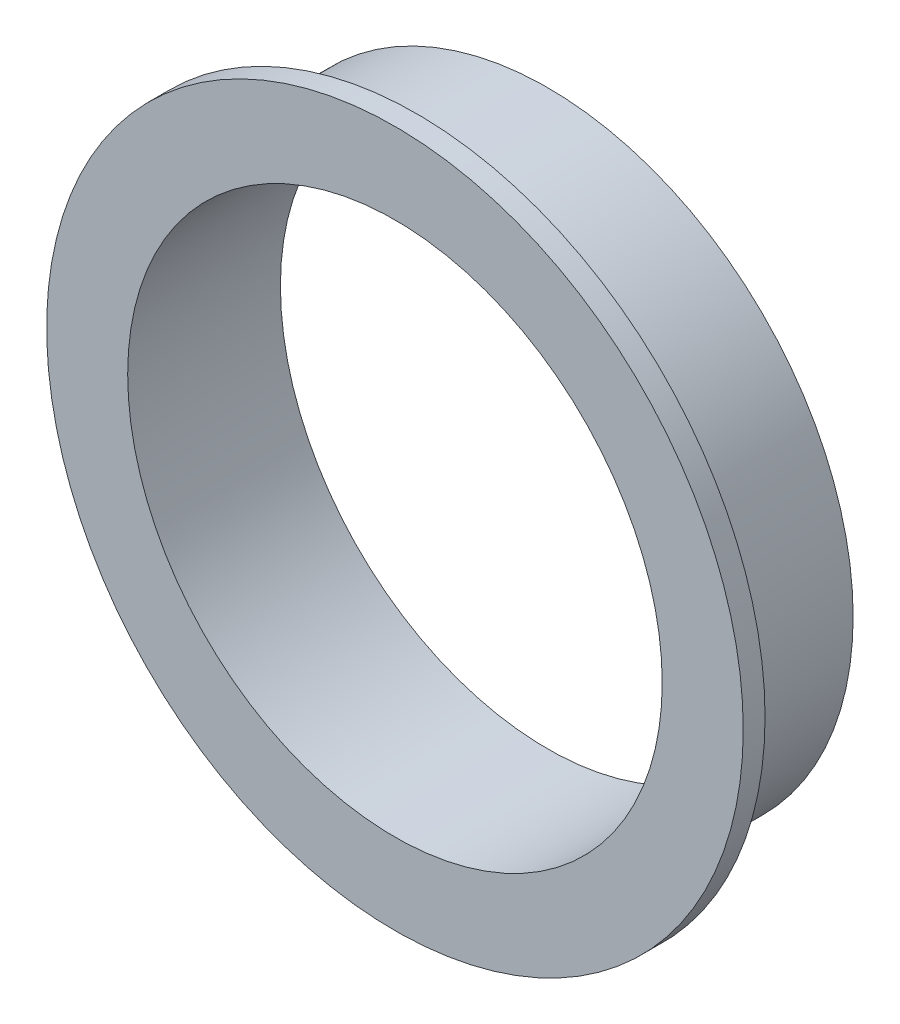
ISO-10303-21;
HEADER;
FILE_DESCRIPTION(('STEP AP214'),'2;1');
FILE_NAME('part.step','',(''),(''),'','','');
FILE_SCHEMA(('AUTOMOTIVE_DESIGN { 1 0 10303 214 1 1 1 1 }'));
ENDSEC;
DATA;
#1=APPLICATION_CONTEXT('core data for automotive mechanical design processes');
#2=APPLICATION_PROTOCOL_DEFINITION('international standard','automotive_design',2000,#1);
#3=PRODUCT_CONTEXT('',#1,'mechanical');
#4=PRODUCT('Part','Part','',(#3));
#5=PRODUCT_RELATED_PRODUCT_CATEGORY('part','',(#4));
#6=PRODUCT_DEFINITION_FORMATION('','',#4);
#7=PRODUCT_DEFINITION_CONTEXT('part definition',#1,'design');
#8=PRODUCT_DEFINITION('design','',#6,#7);
#9=PRODUCT_DEFINITION_SHAPE('','',#8);
#10=(LENGTH_UNIT() NAMED_UNIT(*) SI_UNIT(.MILLI.,.METRE.));
#11=(NAMED_UNIT(*) PLANE_ANGLE_UNIT() SI_UNIT($,.RADIAN.));
#12=(NAMED_UNIT(*) SI_UNIT($,.STERADIAN.) SOLID_ANGLE_UNIT());
#13=UNCERTAINTY_MEASURE_WITH_UNIT(LENGTH_MEASURE(1.E-05),#10,'distance_accuracy_value','');
#14=(GEOMETRIC_REPRESENTATION_CONTEXT(3) GLOBAL_UNCERTAINTY_ASSIGNED_CONTEXT((#13)) GLOBAL_UNIT_ASSIGNED_CONTEXT((#10,
#11,#12)) REPRESENTATION_CONTEXT('',''));
#15=CARTESIAN_POINT('',(0.,0.,0.));
#16=DIRECTION('',(0.,0.,1.));
#17=DIRECTION('',(1.,0.,0.));
#18=AXIS2_PLACEMENT_3D('',#15,#16,#17);
#19=CARTESIAN_POINT('',(0.,0.,-3.));
#20=DIRECTION('',(0.,0.,1.));
#21=DIRECTION('',(1.,0.,0.));
#22=AXIS2_PLACEMENT_3D('',#19,#20,#21);
#23=PLANE('',#22);
#24=CARTESIAN_POINT('',(0.,0.,-3.));
#25=DIRECTION('',(0.,0.,1.));
#26=DIRECTION('',(1.,0.,0.));
#27=AXIS2_PLACEMENT_3D('',#24,#25,#26);
#28=CIRCLE('',#27,14.);
#29=CARTESIAN_POINT('',(14.,0.,-3.));
#30=VERTEX_POINT('',#29);
#31=EDGE_CURVE('E41',#30,#30,#28,.T.);
#32=ORIENTED_EDGE('',*,*,#31,.F.);
#33=EDGE_LOOP('',(#32));
#34=FACE_BOUND('',#33,.T.);
#35=CARTESIAN_POINT('',(0.,0.,-3.));
#36=DIRECTION('',(0.,0.,1.));
#37=DIRECTION('',(1.,0.,0.));
#38=AXIS2_PLACEMENT_3D('',#35,#36,#37);
#39=CIRCLE('',#38,12.25);
#40=CARTESIAN_POINT('',(12.25,0.,-3.));
#41=VERTEX_POINT('',#40);
#42=EDGE_CURVE('E48',#41,#41,#39,.T.);
#43=ORIENTED_EDGE('',*,*,#42,.T.);
#44=EDGE_LOOP('',(#43));
#45=FACE_BOUND('',#44,.T.);
#46=ADVANCED_FACE('F37',(#34,#45),#23,.F.);
#47=CARTESIAN_POINT('',(0.,0.,3.));
#48=DIRECTION('',(0.,0.,-1.));
#49=DIRECTION('',(-1.,0.,0.));
#50=AXIS2_PLACEMENT_3D('',#47,#48,#49);
#51=CYLINDRICAL_SURFACE('',#50,14.);
#52=CARTESIAN_POINT('',(0.,0.,3.));
#53=DIRECTION('',(0.,0.,1.));
#54=DIRECTION('',(1.,0.,0.));
#55=AXIS2_PLACEMENT_3D('',#52,#53,#54);
#56=CIRCLE('',#55,14.);
#57=CARTESIAN_POINT('',(14.,0.,3.));
#58=VERTEX_POINT('',#57);
#59=EDGE_CURVE('E10',#58,#58,#56,.T.);
#60=ORIENTED_EDGE('',*,*,#59,.F.);
#61=EDGE_LOOP('',(#60));
#62=FACE_BOUND('',#61,.T.);
#63=ORIENTED_EDGE('',*,*,#31,.T.);
#64=EDGE_LOOP('',(#63));
#65=FACE_BOUND('',#64,.T.);
#66=ADVANCED_FACE('F39',(#62,#65),#51,.T.);
#67=CARTESIAN_POINT('',(0.,0.,3.));
#68=DIRECTION('',(0.,0.,-1.));
#69=DIRECTION('',(-1.,0.,0.));
#70=AXIS2_PLACEMENT_3D('',#67,#68,#69);
#71=CYLINDRICAL_SURFACE('',#70,12.25);
#72=ORIENTED_EDGE('',*,*,#42,.F.);
#73=EDGE_LOOP('',(#72));
#74=FACE_BOUND('',#73,.T.);
#75=CARTESIAN_POINT('',(0.,0.,4.));
#76=DIRECTION('',(0.,0.,1.));
#77=DIRECTION('',(1.,0.,0.));
#78=AXIS2_PLACEMENT_3D('',#75,#76,#77);
#79=CIRCLE('',#78,12.25);
#80=CARTESIAN_POINT('',(12.25,0.,4.));
#81=VERTEX_POINT('',#80);
#82=EDGE_CURVE('E56',#81,#81,#79,.T.);
#83=ORIENTED_EDGE('',*,*,#82,.T.);
#84=EDGE_LOOP('',(#83));
#85=FACE_BOUND('',#84,.T.);
#86=ADVANCED_FACE('F62',(#74,#85),#71,.F.);
#87=CARTESIAN_POINT('',(0.,0.,4.));
#88=DIRECTION('',(0.,0.,1.));
#89=DIRECTION('',(1.,0.,0.));
#90=AXIS2_PLACEMENT_3D('',#87,#88,#89);
#91=PLANE('',#90);
#92=CARTESIAN_POINT('',(0.,0.,4.));
#93=DIRECTION('',(0.,0.,1.));
#94=DIRECTION('',(1.,0.,0.));
#95=AXIS2_PLACEMENT_3D('',#92,#93,#94);
#96=CIRCLE('',#95,15.9630294323613);
#97=CARTESIAN_POINT('',(15.9630294323613,0.,4.));
#98=VERTEX_POINT('',#97);
#99=EDGE_CURVE('E52',#98,#98,#96,.T.);
#100=ORIENTED_EDGE('',*,*,#99,.T.);
#101=EDGE_LOOP('',(#100));
#102=FACE_BOUND('',#101,.T.);
#103=ORIENTED_EDGE('',*,*,#82,.F.);
#104=EDGE_LOOP('',(#103));
#105=FACE_BOUND('',#104,.T.);
#106=ADVANCED_FACE('F64',(#102,#105),#91,.T.);
#107=CARTESIAN_POINT('',(0.,0.,3.));
#108=DIRECTION('',(0.,0.,1.));
#109=DIRECTION('',(1.,0.,0.));
#110=AXIS2_PLACEMENT_3D('',#107,#108,#109);
#111=PLANE('',#110);
#112=ORIENTED_EDGE('',*,*,#59,.T.);
#113=EDGE_LOOP('',(#112));
#114=FACE_BOUND('',#113,.T.);
#115=CARTESIAN_POINT('',(0.,0.,3.));
#116=DIRECTION('',(0.,0.,1.));
#117=DIRECTION('',(1.,0.,0.));
#118=AXIS2_PLACEMENT_3D('',#115,#116,#117);
#119=CIRCLE('',#118,15.9630294323613);
#120=CARTESIAN_POINT('',(15.9630294323613,0.,3.));
#121=VERTEX_POINT('',#120);
#122=EDGE_CURVE('E53',#121,#121,#119,.T.);
#123=ORIENTED_EDGE('',*,*,#122,.F.);
#124=EDGE_LOOP('',(#123));
#125=FACE_BOUND('',#124,.T.);
#126=ADVANCED_FACE('F66',(#114,#125),#111,.F.);
#127=CARTESIAN_POINT('',(0.,0.,4.));
#128=DIRECTION('',(0.,0.,-1.));
#129=DIRECTION('',(-1.,0.,0.));
#130=AXIS2_PLACEMENT_3D('',#127,#128,#129);
#131=CYLINDRICAL_SURFACE('',#130,15.9630294323613);
#132=ORIENTED_EDGE('',*,*,#99,.F.);
#133=EDGE_LOOP('',(#132));
#134=FACE_BOUND('',#133,.T.);
#135=ORIENTED_EDGE('',*,*,#122,.T.);
#136=EDGE_LOOP('',(#135));
#137=FACE_BOUND('',#136,.T.);
#138=ADVANCED_FACE('F73',(#134,#137),#131,.T.);
#139=CLOSED_SHELL('',(#46,#66,#86,#106,#126,#138));
#140=MANIFOLD_SOLID_BREP('B2',#139);
#141=ADVANCED_BREP_SHAPE_REPRESENTATION('',(#18,#140),#14);
#142=SHAPE_DEFINITION_REPRESENTATION(#9,#141);
ENDSEC;
END-ISO-10303-21;
